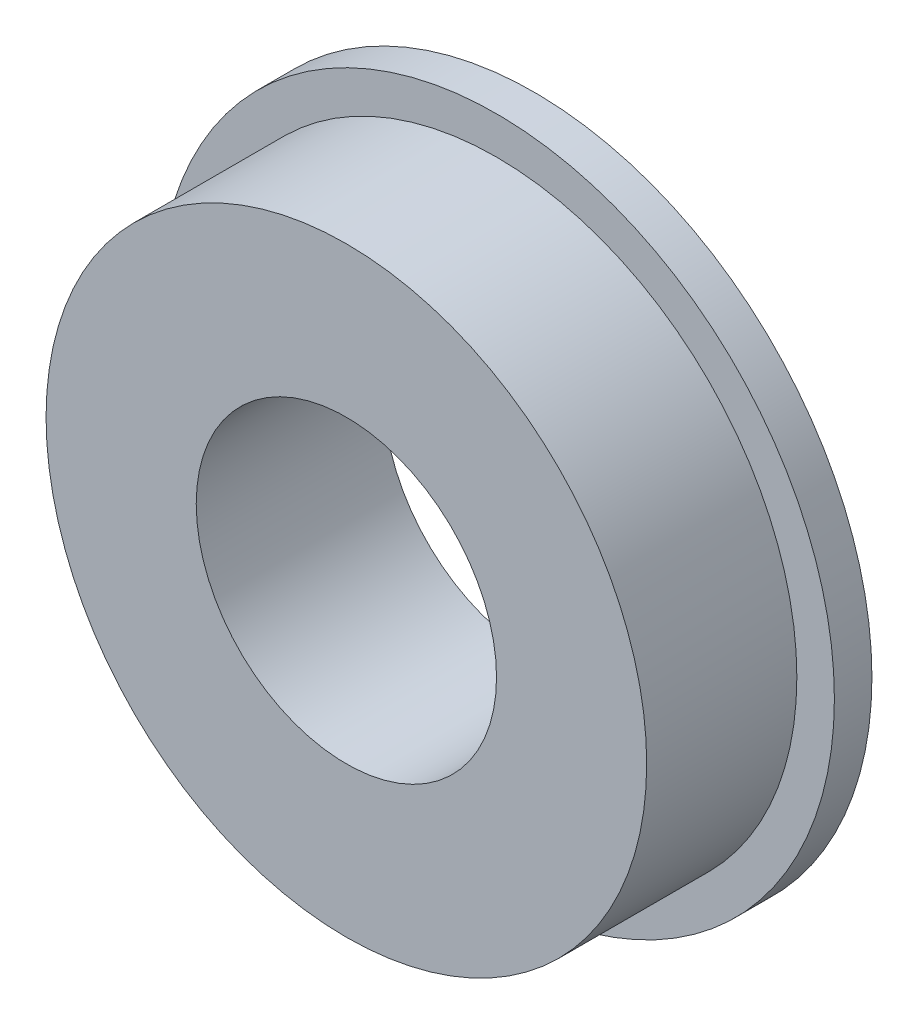
ISO-10303-21;
HEADER;
FILE_DESCRIPTION(('STEP AP214'),'2;1');
FILE_NAME('part.step','',(''),(''),'','','');
FILE_SCHEMA(('AUTOMOTIVE_DESIGN { 1 0 10303 214 1 1 1 1 }'));
ENDSEC;
DATA;
#1=APPLICATION_CONTEXT('core data for automotive mechanical design processes');
#2=APPLICATION_PROTOCOL_DEFINITION('international standard','automotive_design',2000,#1);
#3=PRODUCT_CONTEXT('',#1,'mechanical');
#4=PRODUCT('Part','Part','',(#3));
#5=PRODUCT_RELATED_PRODUCT_CATEGORY('part','',(#4));
#6=PRODUCT_DEFINITION_FORMATION('','',#4);
#7=PRODUCT_DEFINITION_CONTEXT('part definition',#1,'design');
#8=PRODUCT_DEFINITION('design','',#6,#7);
#9=PRODUCT_DEFINITION_SHAPE('','',#8);
#10=(LENGTH_UNIT() NAMED_UNIT(*) SI_UNIT(.MILLI.,.METRE.));
#11=(NAMED_UNIT(*) PLANE_ANGLE_UNIT() SI_UNIT($,.RADIAN.));
#12=(NAMED_UNIT(*) SI_UNIT($,.STERADIAN.) SOLID_ANGLE_UNIT());
#13=UNCERTAINTY_MEASURE_WITH_UNIT(LENGTH_MEASURE(1.E-05),#10,'distance_accuracy_value','');
#14=(GEOMETRIC_REPRESENTATION_CONTEXT(3) GLOBAL_UNCERTAINTY_ASSIGNED_CONTEXT((#13)) GLOBAL_UNIT_ASSIGNED_CONTEXT((#10,
#11,#12)) REPRESENTATION_CONTEXT('',''));
#15=CARTESIAN_POINT('',(0.,0.,0.));
#16=DIRECTION('',(0.,0.,1.));
#17=DIRECTION('',(1.,0.,0.));
#18=AXIS2_PLACEMENT_3D('',#15,#16,#17);
#19=CARTESIAN_POINT('',(0.,0.,5.));
#20=DIRECTION('',(0.,0.,1.));
#21=DIRECTION('',(1.,0.,0.));
#22=AXIS2_PLACEMENT_3D('',#19,#20,#21);
#23=PLANE('',#22);
#24=CARTESIAN_POINT('',(0.,0.,5.));
#25=DIRECTION('',(0.,0.,1.));
#26=DIRECTION('',(1.,0.,0.));
#27=AXIS2_PLACEMENT_3D('',#24,#25,#26);
#28=CIRCLE('',#27,4.);
#29=CARTESIAN_POINT('',(4.,0.,5.));
#30=VERTEX_POINT('',#29);
#31=EDGE_CURVE('E42',#30,#30,#28,.T.);
#32=ORIENTED_EDGE('',*,*,#31,.F.);
#33=EDGE_LOOP('',(#32));
#34=FACE_BOUND('',#33,.T.);
#35=CARTESIAN_POINT('',(0.,0.,5.));
#36=DIRECTION('',(0.,0.,1.));
#37=DIRECTION('',(1.,0.,0.));
#38=AXIS2_PLACEMENT_3D('',#35,#36,#37);
#39=CIRCLE('',#38,8.);
#40=CARTESIAN_POINT('',(8.,0.,5.));
#41=VERTEX_POINT('',#40);
#42=EDGE_CURVE('E56',#41,#41,#39,.T.);
#43=ORIENTED_EDGE('',*,*,#42,.T.);
#44=EDGE_LOOP('',(#43));
#45=FACE_BOUND('',#44,.T.);
#46=ADVANCED_FACE('F35',(#34,#45),#23,.T.);
#47=CARTESIAN_POINT('',(0.,0.,5.));
#48=DIRECTION('',(0.,0.,-1.));
#49=DIRECTION('',(-1.,0.,0.));
#50=AXIS2_PLACEMENT_3D('',#47,#48,#49);
#51=CYLINDRICAL_SURFACE('',#50,9.);
#52=CARTESIAN_POINT('',(0.,0.,0.));
#53=DIRECTION('',(0.,0.,1.));
#54=DIRECTION('',(1.,0.,0.));
#55=AXIS2_PLACEMENT_3D('',#52,#53,#54);
#56=CIRCLE('',#55,9.);
#57=CARTESIAN_POINT('',(9.,0.,0.));
#58=VERTEX_POINT('',#57);
#59=EDGE_CURVE('E11',#58,#58,#56,.T.);
#60=ORIENTED_EDGE('',*,*,#59,.T.);
#61=EDGE_LOOP('',(#60));
#62=FACE_BOUND('',#61,.T.);
#63=CARTESIAN_POINT('',(0.,0.,1.));
#64=DIRECTION('',(0.,0.,1.));
#65=DIRECTION('',(1.,0.,0.));
#66=AXIS2_PLACEMENT_3D('',#63,#64,#65);
#67=CIRCLE('',#66,9.);
#68=CARTESIAN_POINT('',(9.,0.,1.));
#69=VERTEX_POINT('',#68);
#70=EDGE_CURVE('E51',#69,#69,#67,.F.);
#71=ORIENTED_EDGE('',*,*,#70,.T.);
#72=EDGE_LOOP('',(#71));
#73=FACE_BOUND('',#72,.T.);
#74=ADVANCED_FACE('F37',(#62,#73),#51,.T.);
#75=CARTESIAN_POINT('',(0.,0.,0.));
#76=DIRECTION('',(0.,0.,1.));
#77=DIRECTION('',(1.,0.,0.));
#78=AXIS2_PLACEMENT_3D('',#75,#76,#77);
#79=PLANE('',#78);
#80=ORIENTED_EDGE('',*,*,#59,.F.);
#81=EDGE_LOOP('',(#80));
#82=FACE_BOUND('',#81,.T.);
#83=CARTESIAN_POINT('',(0.,0.,0.));
#84=DIRECTION('',(0.,0.,1.));
#85=DIRECTION('',(1.,0.,0.));
#86=AXIS2_PLACEMENT_3D('',#83,#84,#85);
#87=CIRCLE('',#86,4.);
#88=CARTESIAN_POINT('',(4.,0.,0.));
#89=VERTEX_POINT('',#88);
#90=EDGE_CURVE('E46',#89,#89,#87,.T.);
#91=ORIENTED_EDGE('',*,*,#90,.T.);
#92=EDGE_LOOP('',(#91));
#93=FACE_BOUND('',#92,.T.);
#94=ADVANCED_FACE('F82',(#82,#93),#79,.F.);
#95=CARTESIAN_POINT('',(0.,0.,5.));
#96=DIRECTION('',(0.,0.,-1.));
#97=DIRECTION('',(-1.,0.,0.));
#98=AXIS2_PLACEMENT_3D('',#95,#96,#97);
#99=CYLINDRICAL_SURFACE('',#98,4.);
#100=ORIENTED_EDGE('',*,*,#31,.T.);
#101=EDGE_LOOP('',(#100));
#102=FACE_BOUND('',#101,.T.);
#103=ORIENTED_EDGE('',*,*,#90,.F.);
#104=EDGE_LOOP('',(#103));
#105=FACE_BOUND('',#104,.T.);
#106=ADVANCED_FACE('F72',(#102,#105),#99,.F.);
#107=CARTESIAN_POINT('',(0.,0.,-25.4558441227157));
#108=DIRECTION('',(0.,0.,1.));
#109=DIRECTION('',(1.,0.,0.));
#110=AXIS2_PLACEMENT_3D('',#107,#108,#109);
#111=CYLINDRICAL_SURFACE('',#110,8.);
#112=CARTESIAN_POINT('',(0.,0.,1.));
#113=DIRECTION('',(0.,0.,1.));
#114=DIRECTION('',(1.,0.,0.));
#115=AXIS2_PLACEMENT_3D('',#112,#113,#114);
#116=CIRCLE('',#115,8.);
#117=CARTESIAN_POINT('',(8.,0.,1.));
#118=VERTEX_POINT('',#117);
#119=EDGE_CURVE('E53',#118,#118,#116,.F.);
#120=ORIENTED_EDGE('',*,*,#119,.F.);
#121=EDGE_LOOP('',(#120));
#122=FACE_BOUND('',#121,.T.);
#123=ORIENTED_EDGE('',*,*,#42,.F.);
#124=EDGE_LOOP('',(#123));
#125=FACE_BOUND('',#124,.T.);
#126=ADVANCED_FACE('F66',(#122,#125),#111,.T.);
#127=CARTESIAN_POINT('',(0.,0.,1.));
#128=DIRECTION('',(0.,0.,1.));
#129=DIRECTION('',(1.,0.,0.));
#130=AXIS2_PLACEMENT_3D('',#127,#128,#129);
#131=PLANE('',#130);
#132=ORIENTED_EDGE('',*,*,#70,.F.);
#133=EDGE_LOOP('',(#132));
#134=FACE_BOUND('',#133,.T.);
#135=ORIENTED_EDGE('',*,*,#119,.T.);
#136=EDGE_LOOP('',(#135));
#137=FACE_BOUND('',#136,.T.);
#138=ADVANCED_FACE('F63',(#134,#137),#131,.T.);
#139=CLOSED_SHELL('',(#46,#74,#94,#106,#126,#138));
#140=MANIFOLD_SOLID_BREP('B2',#139);
#141=ADVANCED_BREP_SHAPE_REPRESENTATION('',(#18,#140),#14);
#142=SHAPE_DEFINITION_REPRESENTATION(#9,#141);
ENDSEC;
END-ISO-10303-21;
